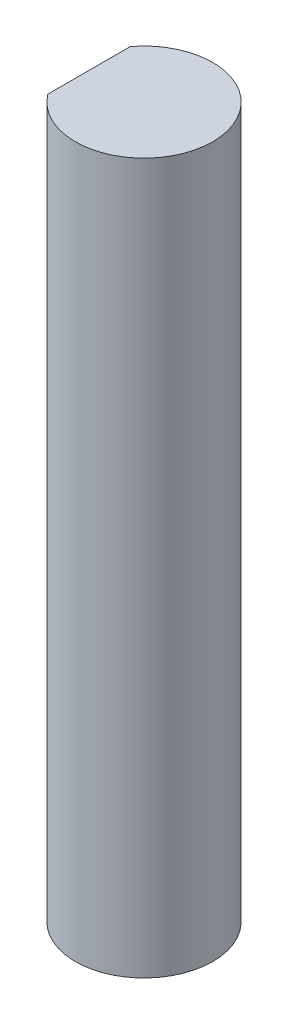
ISO-10303-21;
HEADER;
FILE_DESCRIPTION(('STEP AP214'),'2;1');
FILE_NAME('part.step','',(''),(''),'','','');
FILE_SCHEMA(('AUTOMOTIVE_DESIGN { 1 0 10303 214 1 1 1 1 }'));
ENDSEC;
DATA;
#1=APPLICATION_CONTEXT('core data for automotive mechanical design processes');
#2=APPLICATION_PROTOCOL_DEFINITION('international standard','automotive_design',2000,#1);
#3=PRODUCT_CONTEXT('',#1,'mechanical');
#4=PRODUCT('Part','Part','',(#3));
#5=PRODUCT_RELATED_PRODUCT_CATEGORY('part','',(#4));
#6=PRODUCT_DEFINITION_FORMATION('','',#4);
#7=PRODUCT_DEFINITION_CONTEXT('part definition',#1,'design');
#8=PRODUCT_DEFINITION('design','',#6,#7);
#9=PRODUCT_DEFINITION_SHAPE('','',#8);
#10=(LENGTH_UNIT() NAMED_UNIT(*) SI_UNIT(.MILLI.,.METRE.));
#11=(NAMED_UNIT(*) PLANE_ANGLE_UNIT() SI_UNIT($,.RADIAN.));
#12=(NAMED_UNIT(*) SI_UNIT($,.STERADIAN.) SOLID_ANGLE_UNIT());
#13=UNCERTAINTY_MEASURE_WITH_UNIT(LENGTH_MEASURE(1.E-05),#10,'distance_accuracy_value','');
#14=(GEOMETRIC_REPRESENTATION_CONTEXT(3) GLOBAL_UNCERTAINTY_ASSIGNED_CONTEXT((#13)) GLOBAL_UNIT_ASSIGNED_CONTEXT((#10,
#11,#12)) REPRESENTATION_CONTEXT('',''));
#15=CARTESIAN_POINT('',(0.,0.,0.));
#16=DIRECTION('',(0.,0.,1.));
#17=DIRECTION('',(1.,0.,0.));
#18=AXIS2_PLACEMENT_3D('',#15,#16,#17);
#19=CARTESIAN_POINT('',(0.,31.,0.));
#20=DIRECTION('',(0.,-1.,0.));
#21=DIRECTION('',(0.,0.,-1.));
#22=AXIS2_PLACEMENT_3D('',#19,#20,#21);
#23=CYLINDRICAL_SURFACE('',#22,3.);
#24=CARTESIAN_POINT('',(0.,0.,0.));
#25=DIRECTION('',(0.,1.,0.));
#26=DIRECTION('',(0.,0.,1.));
#27=AXIS2_PLACEMENT_3D('',#24,#25,#26);
#28=CIRCLE('',#27,3.);
#29=CARTESIAN_POINT('',(-2.4,0.,1.8));
#30=VERTEX_POINT('',#29);
#31=CARTESIAN_POINT('',(-2.4,0.,-1.8));
#32=VERTEX_POINT('',#31);
#33=EDGE_CURVE('E63',#30,#32,#28,.T.);
#34=ORIENTED_EDGE('',*,*,#33,.T.);
#35=DIRECTION('',(0.,-1.,0.));
#36=VECTOR('',#35,1.);
#37=CARTESIAN_POINT('',(-2.4,31.,-1.8));
#38=LINE('',#37,#36);
#39=CARTESIAN_POINT('',(-2.4,31.,-1.8));
#40=VERTEX_POINT('',#39);
#41=EDGE_CURVE('E11',#40,#32,#38,.T.);
#42=ORIENTED_EDGE('',*,*,#41,.F.);
#43=CARTESIAN_POINT('',(0.,31.,0.));
#44=DIRECTION('',(0.,1.,0.));
#45=DIRECTION('',(0.,0.,1.));
#46=AXIS2_PLACEMENT_3D('',#43,#44,#45);
#47=CIRCLE('',#46,3.);
#48=CARTESIAN_POINT('',(-2.4,31.,1.8));
#49=VERTEX_POINT('',#48);
#50=EDGE_CURVE('E62',#49,#40,#47,.T.);
#51=ORIENTED_EDGE('',*,*,#50,.F.);
#52=DIRECTION('',(0.,-1.,0.));
#53=VECTOR('',#52,1.);
#54=CARTESIAN_POINT('',(-2.4,31.,1.8));
#55=LINE('',#54,#53);
#56=EDGE_CURVE('E40',#49,#30,#55,.T.);
#57=ORIENTED_EDGE('',*,*,#56,.T.);
#58=EDGE_LOOP('',(#34,#42,#51,#57));
#59=FACE_BOUND('',#58,.T.);
#60=ADVANCED_FACE('F32',(#59),#23,.T.);
#61=CARTESIAN_POINT('',(-2.4,31.,-1.8));
#62=DIRECTION('',(1.,0.,0.));
#63=DIRECTION('',(0.,0.,-1.));
#64=AXIS2_PLACEMENT_3D('',#61,#62,#63);
#65=PLANE('',#64);
#66=DIRECTION('',(0.,0.,1.));
#67=VECTOR('',#66,1.);
#68=CARTESIAN_POINT('',(-2.4,0.,-1.8));
#69=LINE('',#68,#67);
#70=EDGE_CURVE('E55',#32,#30,#69,.T.);
#71=ORIENTED_EDGE('',*,*,#70,.T.);
#72=ORIENTED_EDGE('',*,*,#56,.F.);
#73=DIRECTION('',(0.,0.,1.));
#74=VECTOR('',#73,1.);
#75=CARTESIAN_POINT('',(-2.4,31.,-1.8));
#76=LINE('',#75,#74);
#77=EDGE_CURVE('E47',#40,#49,#76,.T.);
#78=ORIENTED_EDGE('',*,*,#77,.F.);
#79=ORIENTED_EDGE('',*,*,#41,.T.);
#80=EDGE_LOOP('',(#71,#72,#78,#79));
#81=FACE_BOUND('',#80,.T.);
#82=ADVANCED_FACE('F58',(#81),#65,.F.);
#83=CARTESIAN_POINT('',(0.,31.,0.));
#84=DIRECTION('',(0.,1.,0.));
#85=DIRECTION('',(0.,0.,1.));
#86=AXIS2_PLACEMENT_3D('',#83,#84,#85);
#87=PLANE('',#86);
#88=ORIENTED_EDGE('',*,*,#50,.T.);
#89=ORIENTED_EDGE('',*,*,#77,.T.);
#90=EDGE_LOOP('',(#88,#89));
#91=FACE_BOUND('',#90,.T.);
#92=ADVANCED_FACE('F70',(#91),#87,.T.);
#93=CARTESIAN_POINT('',(0.,0.,0.));
#94=DIRECTION('',(0.,1.,0.));
#95=DIRECTION('',(0.,0.,1.));
#96=AXIS2_PLACEMENT_3D('',#93,#94,#95);
#97=PLANE('',#96);
#98=ORIENTED_EDGE('',*,*,#33,.F.);
#99=ORIENTED_EDGE('',*,*,#70,.F.);
#100=EDGE_LOOP('',(#98,#99));
#101=FACE_BOUND('',#100,.T.);
#102=ADVANCED_FACE('F66',(#101),#97,.F.);
#103=CLOSED_SHELL('',(#60,#82,#92,#102));
#104=MANIFOLD_SOLID_BREP('B2',#103);
#105=ADVANCED_BREP_SHAPE_REPRESENTATION('',(#18,#104),#14);
#106=SHAPE_DEFINITION_REPRESENTATION(#9,#105);
ENDSEC;
END-ISO-10303-21;
